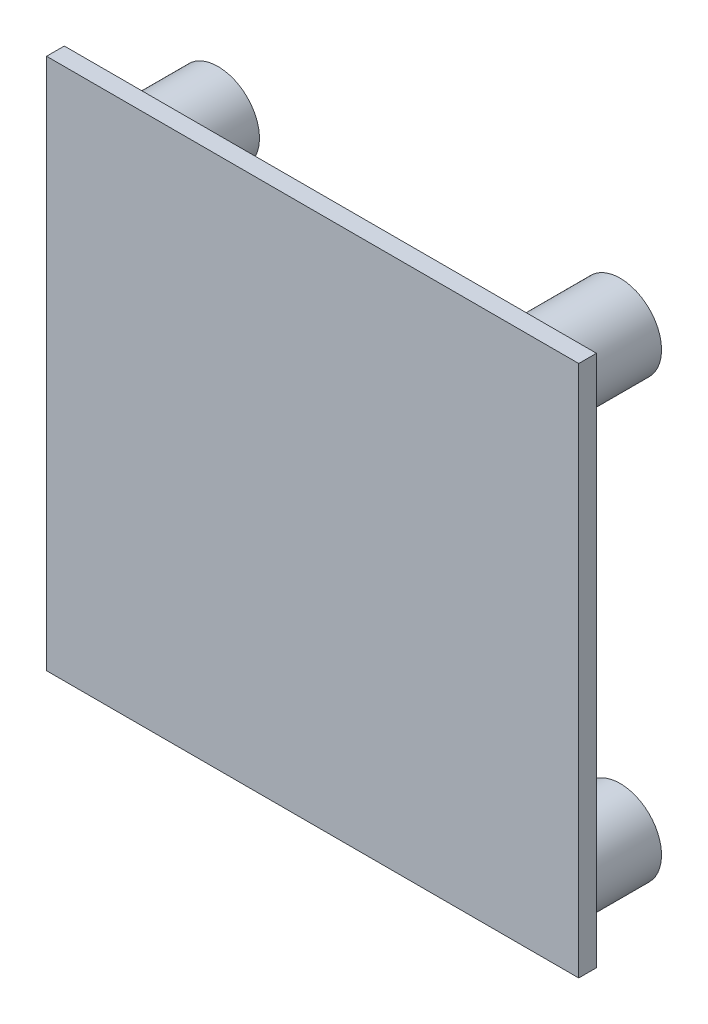
ISO-10303-21;
HEADER;
FILE_DESCRIPTION(('STEP AP214'),'2;1');
FILE_NAME('part.step','',(''),(''),'','','');
FILE_SCHEMA(('AUTOMOTIVE_DESIGN { 1 0 10303 214 1 1 1 1 }'));
ENDSEC;
DATA;
#1=APPLICATION_CONTEXT('core data for automotive mechanical design processes');
#2=APPLICATION_PROTOCOL_DEFINITION('international standard','automotive_design',2000,#1);
#3=PRODUCT_CONTEXT('',#1,'mechanical');
#4=PRODUCT('Part','Part','',(#3));
#5=PRODUCT_RELATED_PRODUCT_CATEGORY('part','',(#4));
#6=PRODUCT_DEFINITION_FORMATION('','',#4);
#7=PRODUCT_DEFINITION_CONTEXT('part definition',#1,'design');
#8=PRODUCT_DEFINITION('design','',#6,#7);
#9=PRODUCT_DEFINITION_SHAPE('','',#8);
#10=(LENGTH_UNIT() NAMED_UNIT(*) SI_UNIT(.MILLI.,.METRE.));
#11=(NAMED_UNIT(*) PLANE_ANGLE_UNIT() SI_UNIT($,.RADIAN.));
#12=(NAMED_UNIT(*) SI_UNIT($,.STERADIAN.) SOLID_ANGLE_UNIT());
#13=UNCERTAINTY_MEASURE_WITH_UNIT(LENGTH_MEASURE(1.E-05),#10,'distance_accuracy_value','');
#14=(GEOMETRIC_REPRESENTATION_CONTEXT(3) GLOBAL_UNCERTAINTY_ASSIGNED_CONTEXT((#13)) GLOBAL_UNIT_ASSIGNED_CONTEXT((#10,
#11,#12)) REPRESENTATION_CONTEXT('',''));
#15=CARTESIAN_POINT('',(0.,0.,0.));
#16=DIRECTION('',(0.,0.,1.));
#17=DIRECTION('',(1.,0.,0.));
#18=AXIS2_PLACEMENT_3D('',#15,#16,#17);
#19=CARTESIAN_POINT('',(0.,0.,1.5));
#20=DIRECTION('',(1.,0.,0.));
#21=DIRECTION('',(0.,1.,0.));
#22=AXIS2_PLACEMENT_3D('',#19,#20,#21);
#23=PLANE('',#22);
#24=DIRECTION('',(0.,-1.,0.));
#25=VECTOR('',#24,1.);
#26=CARTESIAN_POINT('',(0.,0.,0.));
#27=LINE('',#26,#25);
#28=CARTESIAN_POINT('',(0.,45.,0.));
#29=VERTEX_POINT('',#28);
#30=CARTESIAN_POINT('',(0.,0.,0.));
#31=VERTEX_POINT('',#30);
#32=EDGE_CURVE('E111',#29,#31,#27,.T.);
#33=ORIENTED_EDGE('',*,*,#32,.T.);
#34=DIRECTION('',(0.,0.,-1.));
#35=VECTOR('',#34,1.);
#36=CARTESIAN_POINT('',(0.,0.,1.5));
#37=LINE('',#36,#35);
#38=CARTESIAN_POINT('',(0.,0.,1.5));
#39=VERTEX_POINT('',#38);
#40=EDGE_CURVE('E100',#39,#31,#37,.T.);
#41=ORIENTED_EDGE('',*,*,#40,.F.);
#42=DIRECTION('',(0.,-1.,0.));
#43=VECTOR('',#42,1.);
#44=CARTESIAN_POINT('',(0.,0.,1.5));
#45=LINE('',#44,#43);
#46=CARTESIAN_POINT('',(0.,45.,1.5));
#47=VERTEX_POINT('',#46);
#48=EDGE_CURVE('E92',#47,#39,#45,.T.);
#49=ORIENTED_EDGE('',*,*,#48,.F.);
#50=DIRECTION('',(0.,0.,-1.));
#51=VECTOR('',#50,1.);
#52=CARTESIAN_POINT('',(0.,45.,1.5));
#53=LINE('',#52,#51);
#54=EDGE_CURVE('E107',#47,#29,#53,.T.);
#55=ORIENTED_EDGE('',*,*,#54,.T.);
#56=EDGE_LOOP('',(#33,#41,#49,#55));
#57=FACE_BOUND('',#56,.T.);
#58=ADVANCED_FACE('F39',(#57),#23,.F.);
#59=CARTESIAN_POINT('',(0.,0.,1.5));
#60=DIRECTION('',(0.,1.,0.));
#61=DIRECTION('',(0.,0.,1.));
#62=AXIS2_PLACEMENT_3D('',#59,#60,#61);
#63=PLANE('',#62);
#64=DIRECTION('',(1.,0.,0.));
#65=VECTOR('',#64,1.);
#66=CARTESIAN_POINT('',(0.,0.,0.));
#67=LINE('',#66,#65);
#68=CARTESIAN_POINT('',(45.,0.,0.));
#69=VERTEX_POINT('',#68);
#70=EDGE_CURVE('E98',#31,#69,#67,.T.);
#71=ORIENTED_EDGE('',*,*,#70,.T.);
#72=DIRECTION('',(0.,0.,-1.));
#73=VECTOR('',#72,1.);
#74=CARTESIAN_POINT('',(45.,0.,1.5));
#75=LINE('',#74,#73);
#76=CARTESIAN_POINT('',(45.,0.,1.5));
#77=VERTEX_POINT('',#76);
#78=EDGE_CURVE('E96',#77,#69,#75,.T.);
#79=ORIENTED_EDGE('',*,*,#78,.F.);
#80=DIRECTION('',(1.,0.,0.));
#81=VECTOR('',#80,1.);
#82=CARTESIAN_POINT('',(0.,0.,1.5));
#83=LINE('',#82,#81);
#84=EDGE_CURVE('E87',#39,#77,#83,.T.);
#85=ORIENTED_EDGE('',*,*,#84,.F.);
#86=ORIENTED_EDGE('',*,*,#40,.T.);
#87=EDGE_LOOP('',(#71,#79,#85,#86));
#88=FACE_BOUND('',#87,.T.);
#89=ADVANCED_FACE('F97',(#88),#63,.F.);
#90=CARTESIAN_POINT('',(45.,0.,1.5));
#91=DIRECTION('',(-1.,0.,0.));
#92=DIRECTION('',(0.,-1.,0.));
#93=AXIS2_PLACEMENT_3D('',#90,#91,#92);
#94=PLANE('',#93);
#95=DIRECTION('',(0.,1.,0.));
#96=VECTOR('',#95,1.);
#97=CARTESIAN_POINT('',(45.,0.,0.));
#98=LINE('',#97,#96);
#99=CARTESIAN_POINT('',(45.,45.,0.));
#100=VERTEX_POINT('',#99);
#101=EDGE_CURVE('E73',#69,#100,#98,.T.);
#102=ORIENTED_EDGE('',*,*,#101,.T.);
#103=DIRECTION('',(0.,0.,-1.));
#104=VECTOR('',#103,1.);
#105=CARTESIAN_POINT('',(45.,45.,1.5));
#106=LINE('',#105,#104);
#107=CARTESIAN_POINT('',(45.,45.,1.5));
#108=VERTEX_POINT('',#107);
#109=EDGE_CURVE('E101',#108,#100,#106,.T.);
#110=ORIENTED_EDGE('',*,*,#109,.F.);
#111=DIRECTION('',(0.,1.,0.));
#112=VECTOR('',#111,1.);
#113=CARTESIAN_POINT('',(45.,0.,1.5));
#114=LINE('',#113,#112);
#115=EDGE_CURVE('E90',#77,#108,#114,.T.);
#116=ORIENTED_EDGE('',*,*,#115,.F.);
#117=ORIENTED_EDGE('',*,*,#78,.T.);
#118=EDGE_LOOP('',(#102,#110,#116,#117));
#119=FACE_BOUND('',#118,.T.);
#120=ADVANCED_FACE('F103',(#119),#94,.F.);
#121=CARTESIAN_POINT('',(0.,45.,1.5));
#122=DIRECTION('',(0.,-1.,0.));
#123=DIRECTION('',(0.,0.,-1.));
#124=AXIS2_PLACEMENT_3D('',#121,#122,#123);
#125=PLANE('',#124);
#126=DIRECTION('',(-1.,0.,0.));
#127=VECTOR('',#126,1.);
#128=CARTESIAN_POINT('',(0.,45.,0.));
#129=LINE('',#128,#127);
#130=EDGE_CURVE('E79',#100,#29,#129,.T.);
#131=ORIENTED_EDGE('',*,*,#130,.T.);
#132=ORIENTED_EDGE('',*,*,#54,.F.);
#133=DIRECTION('',(-1.,0.,0.));
#134=VECTOR('',#133,1.);
#135=CARTESIAN_POINT('',(0.,45.,1.5));
#136=LINE('',#135,#134);
#137=EDGE_CURVE('E56',#108,#47,#136,.T.);
#138=ORIENTED_EDGE('',*,*,#137,.F.);
#139=ORIENTED_EDGE('',*,*,#109,.T.);
#140=EDGE_LOOP('',(#131,#132,#138,#139));
#141=FACE_BOUND('',#140,.T.);
#142=ADVANCED_FACE('F185',(#141),#125,.F.);
#143=CARTESIAN_POINT('',(0.,0.,1.5));
#144=DIRECTION('',(0.,0.,-1.));
#145=DIRECTION('',(-1.,0.,0.));
#146=AXIS2_PLACEMENT_3D('',#143,#144,#145);
#147=PLANE('',#146);
#148=ORIENTED_EDGE('',*,*,#48,.T.);
#149=ORIENTED_EDGE('',*,*,#84,.T.);
#150=ORIENTED_EDGE('',*,*,#115,.T.);
#151=ORIENTED_EDGE('',*,*,#137,.T.);
#152=EDGE_LOOP('',(#148,#149,#150,#151));
#153=FACE_BOUND('',#152,.T.);
#154=ADVANCED_FACE('F88',(#153),#147,.F.);
#155=CARTESIAN_POINT('',(0.,0.,0.));
#156=DIRECTION('',(0.,0.,-1.));
#157=DIRECTION('',(-1.,0.,0.));
#158=AXIS2_PLACEMENT_3D('',#155,#156,#157);
#159=PLANE('',#158);
#160=CARTESIAN_POINT('',(5.99999999999999,6.5,0.));
#161=DIRECTION('',(0.,0.,-1.));
#162=DIRECTION('',(-1.,0.,0.));
#163=AXIS2_PLACEMENT_3D('',#160,#161,#162);
#164=CIRCLE('',#163,3.5);
#165=CARTESIAN_POINT('',(2.49999999999999,6.5,0.));
#166=VERTEX_POINT('',#165);
#167=EDGE_CURVE('E236',#166,#166,#164,.T.);
#168=ORIENTED_EDGE('',*,*,#167,.F.);
#169=EDGE_LOOP('',(#168));
#170=FACE_BOUND('',#169,.T.);
#171=CARTESIAN_POINT('',(40.,4.,0.));
#172=DIRECTION('',(0.,0.,-1.));
#173=DIRECTION('',(-1.,0.,0.));
#174=AXIS2_PLACEMENT_3D('',#171,#172,#173);
#175=CIRCLE('',#174,3.5);
#176=CARTESIAN_POINT('',(36.5,4.,0.));
#177=VERTEX_POINT('',#176);
#178=EDGE_CURVE('E250',#177,#177,#175,.T.);
#179=ORIENTED_EDGE('',*,*,#178,.F.);
#180=EDGE_LOOP('',(#179));
#181=FACE_BOUND('',#180,.T.);
#182=CARTESIAN_POINT('',(5.99999999999999,39.5,0.));
#183=DIRECTION('',(0.,0.,-1.));
#184=DIRECTION('',(-1.,0.,0.));
#185=AXIS2_PLACEMENT_3D('',#182,#183,#184);
#186=CIRCLE('',#185,3.5);
#187=CARTESIAN_POINT('',(2.49999999999999,39.5,0.));
#188=VERTEX_POINT('',#187);
#189=EDGE_CURVE('E262',#188,#188,#186,.T.);
#190=ORIENTED_EDGE('',*,*,#189,.F.);
#191=EDGE_LOOP('',(#190));
#192=FACE_BOUND('',#191,.T.);
#193=CARTESIAN_POINT('',(40.,41.,0.));
#194=DIRECTION('',(0.,0.,-1.));
#195=DIRECTION('',(-1.,0.,0.));
#196=AXIS2_PLACEMENT_3D('',#193,#194,#195);
#197=CIRCLE('',#196,3.5);
#198=CARTESIAN_POINT('',(36.5,41.,0.));
#199=VERTEX_POINT('',#198);
#200=EDGE_CURVE('E273',#199,#199,#197,.T.);
#201=ORIENTED_EDGE('',*,*,#200,.F.);
#202=EDGE_LOOP('',(#201));
#203=FACE_BOUND('',#202,.T.);
#204=ORIENTED_EDGE('',*,*,#32,.F.);
#205=ORIENTED_EDGE('',*,*,#130,.F.);
#206=ORIENTED_EDGE('',*,*,#101,.F.);
#207=ORIENTED_EDGE('',*,*,#70,.F.);
#208=EDGE_LOOP('',(#204,#205,#206,#207));
#209=FACE_BOUND('',#208,.T.);
#210=ADVANCED_FACE('F157',(#170,#181,#192,#203,#209),#159,.T.);
#211=CARTESIAN_POINT('',(40.,41.,-7.));
#212=DIRECTION('',(0.,0.,-1.));
#213=DIRECTION('',(-1.,0.,0.));
#214=AXIS2_PLACEMENT_3D('',#211,#212,#213);
#215=PLANE('',#214);
#216=CARTESIAN_POINT('',(40.,41.,-7.));
#217=DIRECTION('',(0.,0.,-1.));
#218=DIRECTION('',(-1.,0.,0.));
#219=AXIS2_PLACEMENT_3D('',#216,#217,#218);
#220=CIRCLE('',#219,3.5);
#221=CARTESIAN_POINT('',(36.5,41.,-7.));
#222=VERTEX_POINT('',#221);
#223=EDGE_CURVE('E115',#222,#222,#220,.T.);
#224=ORIENTED_EDGE('',*,*,#223,.T.);
#225=EDGE_LOOP('',(#224));
#226=FACE_BOUND('',#225,.T.);
#227=CARTESIAN_POINT('',(40.,41.,-7.));
#228=DIRECTION('',(0.,0.,-1.));
#229=DIRECTION('',(-1.,0.,0.));
#230=AXIS2_PLACEMENT_3D('',#227,#228,#229);
#231=CIRCLE('',#230,1.5);
#232=CARTESIAN_POINT('',(38.5,41.,-7.));
#233=VERTEX_POINT('',#232);
#234=EDGE_CURVE('E267',#233,#233,#231,.T.);
#235=ORIENTED_EDGE('',*,*,#234,.F.);
#236=EDGE_LOOP('',(#235));
#237=FACE_BOUND('',#236,.T.);
#238=ADVANCED_FACE('F176',(#226,#237),#215,.T.);
#239=CARTESIAN_POINT('',(40.,41.,-7.));
#240=DIRECTION('',(0.,0.,1.));
#241=DIRECTION('',(1.,0.,0.));
#242=AXIS2_PLACEMENT_3D('',#239,#240,#241);
#243=CYLINDRICAL_SURFACE('',#242,3.5);
#244=ORIENTED_EDGE('',*,*,#223,.F.);
#245=EDGE_LOOP('',(#244));
#246=FACE_BOUND('',#245,.T.);
#247=ORIENTED_EDGE('',*,*,#200,.T.);
#248=EDGE_LOOP('',(#247));
#249=FACE_BOUND('',#248,.T.);
#250=ADVANCED_FACE('F182',(#246,#249),#243,.T.);
#251=CARTESIAN_POINT('',(40.,41.,-7.));
#252=DIRECTION('',(0.,0.,1.));
#253=DIRECTION('',(1.,0.,0.));
#254=AXIS2_PLACEMENT_3D('',#251,#252,#253);
#255=CYLINDRICAL_SURFACE('',#254,1.5);
#256=ORIENTED_EDGE('',*,*,#234,.T.);
#257=EDGE_LOOP('',(#256));
#258=FACE_BOUND('',#257,.T.);
#259=CARTESIAN_POINT('',(40.,41.,0.));
#260=DIRECTION('',(0.,0.,-1.));
#261=DIRECTION('',(-1.,0.,0.));
#262=AXIS2_PLACEMENT_3D('',#259,#260,#261);
#263=CIRCLE('',#262,1.5);
#264=CARTESIAN_POINT('',(38.5,41.,0.));
#265=VERTEX_POINT('',#264);
#266=EDGE_CURVE('E128',#265,#265,#263,.F.);
#267=ORIENTED_EDGE('',*,*,#266,.T.);
#268=EDGE_LOOP('',(#267));
#269=FACE_BOUND('',#268,.T.);
#270=ADVANCED_FACE('F190',(#258,#269),#255,.F.);
#271=ORIENTED_EDGE('',*,*,#266,.F.);
#272=EDGE_LOOP('',(#271));
#273=FACE_BOUND('',#272,.T.);
#274=ADVANCED_FACE('F164',(#273),#159,.T.);
#275=CARTESIAN_POINT('',(5.99999999999999,39.5,-7.));
#276=DIRECTION('',(0.,0.,-1.));
#277=DIRECTION('',(-1.,0.,0.));
#278=AXIS2_PLACEMENT_3D('',#275,#276,#277);
#279=PLANE('',#278);
#280=CARTESIAN_POINT('',(5.99999999999999,39.5,-7.));
#281=DIRECTION('',(0.,0.,-1.));
#282=DIRECTION('',(-1.,0.,0.));
#283=AXIS2_PLACEMENT_3D('',#280,#281,#282);
#284=CIRCLE('',#283,3.5);
#285=CARTESIAN_POINT('',(2.49999999999999,39.5,-7.));
#286=VERTEX_POINT('',#285);
#287=EDGE_CURVE('E263',#286,#286,#284,.T.);
#288=ORIENTED_EDGE('',*,*,#287,.T.);
#289=EDGE_LOOP('',(#288));
#290=FACE_BOUND('',#289,.T.);
#291=CARTESIAN_POINT('',(5.99999999999999,39.5,-7.));
#292=DIRECTION('',(0.,0.,-1.));
#293=DIRECTION('',(-1.,0.,0.));
#294=AXIS2_PLACEMENT_3D('',#291,#292,#293);
#295=CIRCLE('',#294,1.5);
#296=CARTESIAN_POINT('',(4.49999999999999,39.5,-7.));
#297=VERTEX_POINT('',#296);
#298=EDGE_CURVE('E255',#297,#297,#295,.T.);
#299=ORIENTED_EDGE('',*,*,#298,.F.);
#300=EDGE_LOOP('',(#299));
#301=FACE_BOUND('',#300,.T.);
#302=ADVANCED_FACE('F189',(#290,#301),#279,.T.);
#303=CARTESIAN_POINT('',(5.99999999999999,39.5,-7.));
#304=DIRECTION('',(0.,0.,1.));
#305=DIRECTION('',(1.,0.,0.));
#306=AXIS2_PLACEMENT_3D('',#303,#304,#305);
#307=CYLINDRICAL_SURFACE('',#306,3.5);
#308=ORIENTED_EDGE('',*,*,#287,.F.);
#309=EDGE_LOOP('',(#308));
#310=FACE_BOUND('',#309,.T.);
#311=ORIENTED_EDGE('',*,*,#189,.T.);
#312=EDGE_LOOP('',(#311));
#313=FACE_BOUND('',#312,.T.);
#314=ADVANCED_FACE('F196',(#310,#313),#307,.T.);
#315=CARTESIAN_POINT('',(5.99999999999999,39.5,-7.));
#316=DIRECTION('',(0.,0.,1.));
#317=DIRECTION('',(1.,0.,0.));
#318=AXIS2_PLACEMENT_3D('',#315,#316,#317);
#319=CYLINDRICAL_SURFACE('',#318,1.5);
#320=ORIENTED_EDGE('',*,*,#298,.T.);
#321=EDGE_LOOP('',(#320));
#322=FACE_BOUND('',#321,.T.);
#323=CARTESIAN_POINT('',(5.99999999999999,39.5,0.));
#324=DIRECTION('',(0.,0.,-1.));
#325=DIRECTION('',(-1.,0.,0.));
#326=AXIS2_PLACEMENT_3D('',#323,#324,#325);
#327=CIRCLE('',#326,1.5);
#328=CARTESIAN_POINT('',(4.49999999999999,39.5,0.));
#329=VERTEX_POINT('',#328);
#330=EDGE_CURVE('E132',#329,#329,#327,.F.);
#331=ORIENTED_EDGE('',*,*,#330,.T.);
#332=EDGE_LOOP('',(#331));
#333=FACE_BOUND('',#332,.T.);
#334=ADVANCED_FACE('F162',(#322,#333),#319,.F.);
#335=ORIENTED_EDGE('',*,*,#330,.F.);
#336=EDGE_LOOP('',(#335));
#337=FACE_BOUND('',#336,.T.);
#338=ADVANCED_FACE('F145',(#337),#159,.T.);
#339=CARTESIAN_POINT('',(40.,4.,-7.));
#340=DIRECTION('',(0.,0.,-1.));
#341=DIRECTION('',(-1.,0.,0.));
#342=AXIS2_PLACEMENT_3D('',#339,#340,#341);
#343=PLANE('',#342);
#344=CARTESIAN_POINT('',(40.,4.,-7.));
#345=DIRECTION('',(0.,0.,-1.));
#346=DIRECTION('',(-1.,0.,0.));
#347=AXIS2_PLACEMENT_3D('',#344,#345,#346);
#348=CIRCLE('',#347,3.5);
#349=CARTESIAN_POINT('',(36.5,4.,-7.));
#350=VERTEX_POINT('',#349);
#351=EDGE_CURVE('E251',#350,#350,#348,.T.);
#352=ORIENTED_EDGE('',*,*,#351,.T.);
#353=EDGE_LOOP('',(#352));
#354=FACE_BOUND('',#353,.T.);
#355=CARTESIAN_POINT('',(40.,4.,-7.));
#356=DIRECTION('',(0.,0.,-1.));
#357=DIRECTION('',(-1.,0.,0.));
#358=AXIS2_PLACEMENT_3D('',#355,#356,#357);
#359=CIRCLE('',#358,1.5);
#360=CARTESIAN_POINT('',(38.5,4.,-7.));
#361=VERTEX_POINT('',#360);
#362=EDGE_CURVE('E245',#361,#361,#359,.T.);
#363=ORIENTED_EDGE('',*,*,#362,.F.);
#364=EDGE_LOOP('',(#363));
#365=FACE_BOUND('',#364,.T.);
#366=ADVANCED_FACE('F161',(#354,#365),#343,.T.);
#367=CARTESIAN_POINT('',(40.,4.,-7.));
#368=DIRECTION('',(0.,0.,1.));
#369=DIRECTION('',(1.,0.,0.));
#370=AXIS2_PLACEMENT_3D('',#367,#368,#369);
#371=CYLINDRICAL_SURFACE('',#370,3.5);
#372=ORIENTED_EDGE('',*,*,#351,.F.);
#373=EDGE_LOOP('',(#372));
#374=FACE_BOUND('',#373,.T.);
#375=ORIENTED_EDGE('',*,*,#178,.T.);
#376=EDGE_LOOP('',(#375));
#377=FACE_BOUND('',#376,.T.);
#378=ADVANCED_FACE('F154',(#374,#377),#371,.T.);
#379=CARTESIAN_POINT('',(40.,4.,-7.));
#380=DIRECTION('',(0.,0.,1.));
#381=DIRECTION('',(1.,0.,0.));
#382=AXIS2_PLACEMENT_3D('',#379,#380,#381);
#383=CYLINDRICAL_SURFACE('',#382,1.5);
#384=ORIENTED_EDGE('',*,*,#362,.T.);
#385=EDGE_LOOP('',(#384));
#386=FACE_BOUND('',#385,.T.);
#387=CARTESIAN_POINT('',(40.,4.,0.));
#388=DIRECTION('',(0.,0.,-1.));
#389=DIRECTION('',(-1.,0.,0.));
#390=AXIS2_PLACEMENT_3D('',#387,#388,#389);
#391=CIRCLE('',#390,1.5);
#392=CARTESIAN_POINT('',(38.5,4.,0.));
#393=VERTEX_POINT('',#392);
#394=EDGE_CURVE('E48',#393,#393,#391,.F.);
#395=ORIENTED_EDGE('',*,*,#394,.T.);
#396=EDGE_LOOP('',(#395));
#397=FACE_BOUND('',#396,.T.);
#398=ADVANCED_FACE('F139',(#386,#397),#383,.F.);
#399=ORIENTED_EDGE('',*,*,#394,.F.);
#400=EDGE_LOOP('',(#399));
#401=FACE_BOUND('',#400,.T.);
#402=ADVANCED_FACE('F141',(#401),#159,.T.);
#403=CARTESIAN_POINT('',(5.99999999999999,6.5,-7.));
#404=DIRECTION('',(0.,0.,-1.));
#405=DIRECTION('',(-1.,0.,0.));
#406=AXIS2_PLACEMENT_3D('',#403,#404,#405);
#407=PLANE('',#406);
#408=CARTESIAN_POINT('',(5.99999999999999,6.5,-7.));
#409=DIRECTION('',(0.,0.,-1.));
#410=DIRECTION('',(-1.,0.,0.));
#411=AXIS2_PLACEMENT_3D('',#408,#409,#410);
#412=CIRCLE('',#411,3.5);
#413=CARTESIAN_POINT('',(2.49999999999999,6.5,-7.));
#414=VERTEX_POINT('',#413);
#415=EDGE_CURVE('E240',#414,#414,#412,.T.);
#416=ORIENTED_EDGE('',*,*,#415,.T.);
#417=EDGE_LOOP('',(#416));
#418=FACE_BOUND('',#417,.T.);
#419=CARTESIAN_POINT('',(5.99999999999999,6.5,-7.));
#420=DIRECTION('',(0.,0.,-1.));
#421=DIRECTION('',(-1.,0.,0.));
#422=AXIS2_PLACEMENT_3D('',#419,#420,#421);
#423=CIRCLE('',#422,1.5);
#424=CARTESIAN_POINT('',(4.49999999999999,6.5,-7.));
#425=VERTEX_POINT('',#424);
#426=EDGE_CURVE('E232',#425,#425,#423,.T.);
#427=ORIENTED_EDGE('',*,*,#426,.F.);
#428=EDGE_LOOP('',(#427));
#429=FACE_BOUND('',#428,.T.);
#430=ADVANCED_FACE('F143',(#418,#429),#407,.T.);
#431=CARTESIAN_POINT('',(5.99999999999999,6.5,-7.));
#432=DIRECTION('',(0.,0.,1.));
#433=DIRECTION('',(1.,0.,0.));
#434=AXIS2_PLACEMENT_3D('',#431,#432,#433);
#435=CYLINDRICAL_SURFACE('',#434,3.5);
#436=ORIENTED_EDGE('',*,*,#415,.F.);
#437=EDGE_LOOP('',(#436));
#438=FACE_BOUND('',#437,.T.);
#439=ORIENTED_EDGE('',*,*,#167,.T.);
#440=EDGE_LOOP('',(#439));
#441=FACE_BOUND('',#440,.T.);
#442=ADVANCED_FACE('F151',(#438,#441),#435,.T.);
#443=CARTESIAN_POINT('',(5.99999999999999,6.5,-7.));
#444=DIRECTION('',(0.,0.,1.));
#445=DIRECTION('',(1.,0.,0.));
#446=AXIS2_PLACEMENT_3D('',#443,#444,#445);
#447=CYLINDRICAL_SURFACE('',#446,1.5);
#448=ORIENTED_EDGE('',*,*,#426,.T.);
#449=EDGE_LOOP('',(#448));
#450=FACE_BOUND('',#449,.T.);
#451=CARTESIAN_POINT('',(5.99999999999999,6.5,0.));
#452=DIRECTION('',(0.,0.,-1.));
#453=DIRECTION('',(-1.,0.,0.));
#454=AXIS2_PLACEMENT_3D('',#451,#452,#453);
#455=CIRCLE('',#454,1.5);
#456=CARTESIAN_POINT('',(4.49999999999999,6.5,0.));
#457=VERTEX_POINT('',#456);
#458=EDGE_CURVE('E11',#457,#457,#455,.F.);
#459=ORIENTED_EDGE('',*,*,#458,.T.);
#460=EDGE_LOOP('',(#459));
#461=FACE_BOUND('',#460,.T.);
#462=ADVANCED_FACE('F166',(#450,#461),#447,.F.);
#463=ORIENTED_EDGE('',*,*,#458,.F.);
#464=EDGE_LOOP('',(#463));
#465=FACE_BOUND('',#464,.T.);
#466=ADVANCED_FACE('F146',(#465),#159,.T.);
#467=CLOSED_SHELL('',(#58,#89,#120,#142,#154,#210,#238,#250,#270,#274,#302,#314,#334,#338,#366,
#378,#398,#402,#430,#442,#462,#466));
#468=MANIFOLD_SOLID_BREP('B2',#467);
#469=ADVANCED_BREP_SHAPE_REPRESENTATION('',(#18,#468),#14);
#470=SHAPE_DEFINITION_REPRESENTATION(#9,#469);
ENDSEC;
END-ISO-10303-21;
